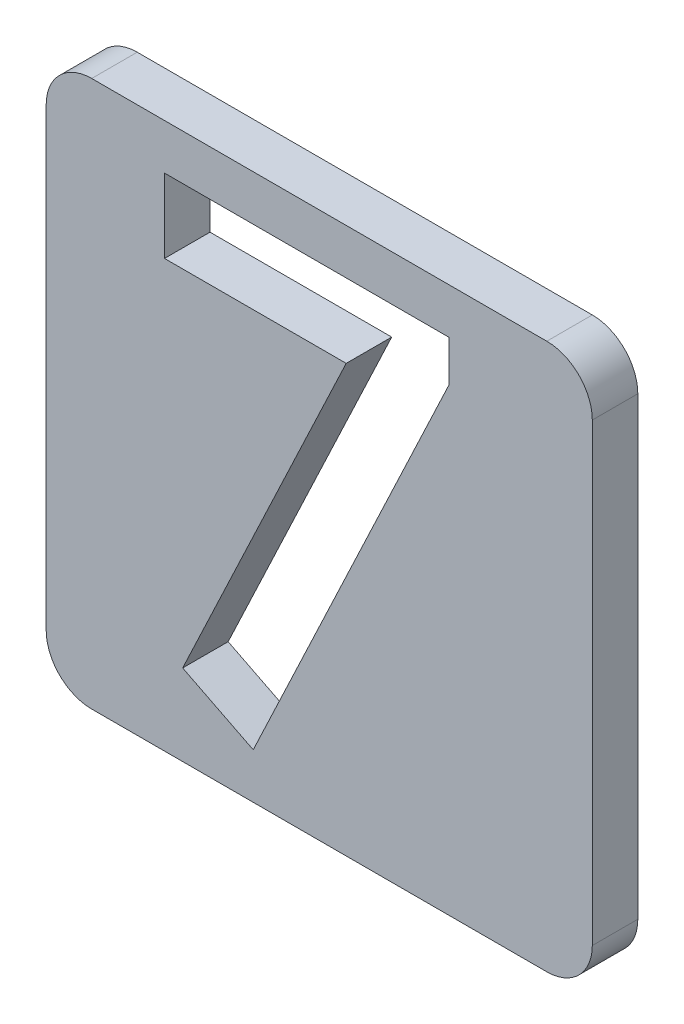
ISO-10303-21;
HEADER;
FILE_DESCRIPTION(('STEP AP214'),'2;1');
FILE_NAME('part.step','',(''),(''),'','','');
FILE_SCHEMA(('AUTOMOTIVE_DESIGN { 1 0 10303 214 1 1 1 1 }'));
ENDSEC;
DATA;
#1=APPLICATION_CONTEXT('core data for automotive mechanical design processes');
#2=APPLICATION_PROTOCOL_DEFINITION('international standard','automotive_design',2000,#1);
#3=PRODUCT_CONTEXT('',#1,'mechanical');
#4=PRODUCT('Part','Part','',(#3));
#5=PRODUCT_RELATED_PRODUCT_CATEGORY('part','',(#4));
#6=PRODUCT_DEFINITION_FORMATION('','',#4);
#7=PRODUCT_DEFINITION_CONTEXT('part definition',#1,'design');
#8=PRODUCT_DEFINITION('design','',#6,#7);
#9=PRODUCT_DEFINITION_SHAPE('','',#8);
#10=(LENGTH_UNIT() NAMED_UNIT(*) SI_UNIT(.MILLI.,.METRE.));
#11=(NAMED_UNIT(*) PLANE_ANGLE_UNIT() SI_UNIT($,.RADIAN.));
#12=(NAMED_UNIT(*) SI_UNIT($,.STERADIAN.) SOLID_ANGLE_UNIT());
#13=UNCERTAINTY_MEASURE_WITH_UNIT(LENGTH_MEASURE(1.E-05),#10,'distance_accuracy_value','');
#14=(GEOMETRIC_REPRESENTATION_CONTEXT(3) GLOBAL_UNCERTAINTY_ASSIGNED_CONTEXT((#13)) GLOBAL_UNIT_ASSIGNED_CONTEXT((#10,
#11,#12)) REPRESENTATION_CONTEXT('',''));
#15=CARTESIAN_POINT('',(0.,0.,0.));
#16=DIRECTION('',(0.,0.,1.));
#17=DIRECTION('',(1.,0.,0.));
#18=AXIS2_PLACEMENT_3D('',#15,#16,#17);
#19=CARTESIAN_POINT('',(50.,50.,10.));
#20=DIRECTION('',(0.,0.,-1.));
#21=DIRECTION('',(-1.,0.,0.));
#22=AXIS2_PLACEMENT_3D('',#19,#20,#21);
#23=PLANE('',#22);
#24=DIRECTION('',(1.,0.,0.));
#25=VECTOR('',#24,1.);
#26=CARTESIAN_POINT('',(-49.9999999999999,60.,10.));
#27=LINE('',#26,#25);
#28=CARTESIAN_POINT('',(-49.9999999999999,60.,10.));
#29=VERTEX_POINT('',#28);
#30=CARTESIAN_POINT('',(49.9999999999999,60.,10.));
#31=VERTEX_POINT('',#30);
#32=EDGE_CURVE('E200',#29,#31,#27,.T.);
#33=ORIENTED_EDGE('',*,*,#32,.F.);
#34=CARTESIAN_POINT('',(-50.,50.,10.));
#35=DIRECTION('',(0.,0.,1.));
#36=DIRECTION('',(1.,0.,0.));
#37=AXIS2_PLACEMENT_3D('',#34,#35,#36);
#38=CIRCLE('',#37,10.);
#39=CARTESIAN_POINT('',(-60.,49.9999999999999,10.));
#40=VERTEX_POINT('',#39);
#41=EDGE_CURVE('E218',#29,#40,#38,.T.);
#42=ORIENTED_EDGE('',*,*,#41,.T.);
#43=DIRECTION('',(0.,-1.,0.));
#44=VECTOR('',#43,1.);
#45=CARTESIAN_POINT('',(-60.,49.9999999999999,10.));
#46=LINE('',#45,#44);
#47=CARTESIAN_POINT('',(-60.,-49.9999999999999,10.));
#48=VERTEX_POINT('',#47);
#49=EDGE_CURVE('E216',#40,#48,#46,.T.);
#50=ORIENTED_EDGE('',*,*,#49,.T.);
#51=CARTESIAN_POINT('',(-50.,-50.,10.));
#52=DIRECTION('',(0.,0.,1.));
#53=DIRECTION('',(1.,0.,0.));
#54=AXIS2_PLACEMENT_3D('',#51,#52,#53);
#55=CIRCLE('',#54,10.);
#56=CARTESIAN_POINT('',(-49.9999999999999,-60.,10.));
#57=VERTEX_POINT('',#56);
#58=EDGE_CURVE('E214',#48,#57,#55,.T.);
#59=ORIENTED_EDGE('',*,*,#58,.T.);
#60=DIRECTION('',(1.,0.,0.));
#61=VECTOR('',#60,1.);
#62=CARTESIAN_POINT('',(-49.9999999999999,-60.,10.));
#63=LINE('',#62,#61);
#64=CARTESIAN_POINT('',(49.9999999999999,-60.,10.));
#65=VERTEX_POINT('',#64);
#66=EDGE_CURVE('E212',#57,#65,#63,.T.);
#67=ORIENTED_EDGE('',*,*,#66,.T.);
#68=CARTESIAN_POINT('',(50.,-50.,10.));
#69=DIRECTION('',(0.,0.,1.));
#70=DIRECTION('',(1.,0.,0.));
#71=AXIS2_PLACEMENT_3D('',#68,#69,#70);
#72=CIRCLE('',#71,10.);
#73=CARTESIAN_POINT('',(60.,-50.,10.));
#74=VERTEX_POINT('',#73);
#75=EDGE_CURVE('E210',#65,#74,#72,.T.);
#76=ORIENTED_EDGE('',*,*,#75,.T.);
#77=DIRECTION('',(0.,-1.,0.));
#78=VECTOR('',#77,1.);
#79=CARTESIAN_POINT('',(60.,49.9999999999999,10.));
#80=LINE('',#79,#78);
#81=CARTESIAN_POINT('',(60.,49.9999999999999,10.));
#82=VERTEX_POINT('',#81);
#83=EDGE_CURVE('E207',#82,#74,#80,.T.);
#84=ORIENTED_EDGE('',*,*,#83,.F.);
#85=CARTESIAN_POINT('',(50.,50.,10.));
#86=DIRECTION('',(0.,0.,-1.));
#87=DIRECTION('',(-1.,0.,0.));
#88=AXIS2_PLACEMENT_3D('',#85,#86,#87);
#89=CIRCLE('',#88,10.);
#90=EDGE_CURVE('E203',#31,#82,#89,.T.);
#91=ORIENTED_EDGE('',*,*,#90,.F.);
#92=EDGE_LOOP('',(#33,#42,#50,#59,#67,#76,#84,#91));
#93=FACE_BOUND('',#92,.T.);
#94=DIRECTION('',(0.,1.,0.));
#95=VECTOR('',#94,1.);
#96=CARTESIAN_POINT('',(-34.,33.75,10.));
#97=LINE('',#96,#95);
#98=CARTESIAN_POINT('',(-34.,33.75,10.));
#99=VERTEX_POINT('',#98);
#100=CARTESIAN_POINT('',(-34.,50.,10.));
#101=VERTEX_POINT('',#100);
#102=EDGE_CURVE('E50',#99,#101,#97,.T.);
#103=ORIENTED_EDGE('',*,*,#102,.T.);
#104=DIRECTION('',(1.,0.,0.));
#105=VECTOR('',#104,1.);
#106=CARTESIAN_POINT('',(-34.,50.,10.));
#107=LINE('',#106,#105);
#108=CARTESIAN_POINT('',(28.5,50.,10.));
#109=VERTEX_POINT('',#108);
#110=EDGE_CURVE('E156',#101,#109,#107,.T.);
#111=ORIENTED_EDGE('',*,*,#110,.T.);
#112=DIRECTION('',(0.,-1.,0.));
#113=VECTOR('',#112,1.);
#114=CARTESIAN_POINT('',(28.5,50.,10.));
#115=LINE('',#114,#113);
#116=CARTESIAN_POINT('',(28.5,40.91796875,10.));
#117=VERTEX_POINT('',#116);
#118=EDGE_CURVE('E177',#109,#117,#115,.T.);
#119=ORIENTED_EDGE('',*,*,#118,.T.);
#120=DIRECTION('',(-0.427610471419761,-0.903963099209348,0.));
#121=VECTOR('',#120,1.);
#122=CARTESIAN_POINT('',(28.5,40.91796875,10.));
#123=LINE('',#122,#121);
#124=CARTESIAN_POINT('',(-14.5078125,-50.,10.));
#125=VERTEX_POINT('',#124);
#126=EDGE_CURVE('E180',#117,#125,#123,.T.);
#127=ORIENTED_EDGE('',*,*,#126,.T.);
#128=DIRECTION('',(-0.893073384293623,0.44991102483306,0.));
#129=VECTOR('',#128,1.);
#130=CARTESIAN_POINT('',(-14.5078125,-50.,10.));
#131=LINE('',#130,#129);
#132=CARTESIAN_POINT('',(-30.015625,-42.1875,10.));
#133=VERTEX_POINT('',#132);
#134=EDGE_CURVE('E183',#125,#133,#131,.T.);
#135=ORIENTED_EDGE('',*,*,#134,.T.);
#136=DIRECTION('',(0.427766523959501,0.903889263670946,0.));
#137=VECTOR('',#136,1.);
#138=CARTESIAN_POINT('',(-30.015625,-42.1875,10.));
#139=LINE('',#138,#137);
#140=CARTESIAN_POINT('',(5.921875,33.75,10.));
#141=VERTEX_POINT('',#140);
#142=EDGE_CURVE('E186',#133,#141,#139,.T.);
#143=ORIENTED_EDGE('',*,*,#142,.T.);
#144=DIRECTION('',(-1.,0.,0.));
#145=VECTOR('',#144,1.);
#146=CARTESIAN_POINT('',(5.921875,33.75,10.));
#147=LINE('',#146,#145);
#148=EDGE_CURVE('E150',#141,#99,#147,.T.);
#149=ORIENTED_EDGE('',*,*,#148,.T.);
#150=EDGE_LOOP('',(#103,#111,#119,#127,#135,#143,#149));
#151=FACE_BOUND('',#150,.T.);
#152=ADVANCED_FACE('F33',(#93,#151),#23,.F.);
#153=CARTESIAN_POINT('',(50.,50.,0.));
#154=DIRECTION('',(0.,0.,-1.));
#155=DIRECTION('',(-1.,0.,0.));
#156=AXIS2_PLACEMENT_3D('',#153,#154,#155);
#157=PLANE('',#156);
#158=DIRECTION('',(1.,0.,0.));
#159=VECTOR('',#158,1.);
#160=CARTESIAN_POINT('',(-49.9999999999999,60.,0.));
#161=LINE('',#160,#159);
#162=CARTESIAN_POINT('',(-49.9999999999999,60.,0.));
#163=VERTEX_POINT('',#162);
#164=CARTESIAN_POINT('',(49.9999999999999,60.,0.));
#165=VERTEX_POINT('',#164);
#166=EDGE_CURVE('E157',#163,#165,#161,.T.);
#167=ORIENTED_EDGE('',*,*,#166,.T.);
#168=CARTESIAN_POINT('',(50.,50.,0.));
#169=DIRECTION('',(0.,0.,-1.));
#170=DIRECTION('',(-1.,0.,0.));
#171=AXIS2_PLACEMENT_3D('',#168,#169,#170);
#172=CIRCLE('',#171,10.);
#173=CARTESIAN_POINT('',(60.,49.9999999999999,0.));
#174=VERTEX_POINT('',#173);
#175=EDGE_CURVE('E222',#165,#174,#172,.T.);
#176=ORIENTED_EDGE('',*,*,#175,.T.);
#177=DIRECTION('',(0.,-1.,0.));
#178=VECTOR('',#177,1.);
#179=CARTESIAN_POINT('',(60.,49.9999999999999,0.));
#180=LINE('',#179,#178);
#181=CARTESIAN_POINT('',(60.,-50.,0.));
#182=VERTEX_POINT('',#181);
#183=EDGE_CURVE('E225',#174,#182,#180,.T.);
#184=ORIENTED_EDGE('',*,*,#183,.T.);
#185=CARTESIAN_POINT('',(50.,-50.,0.));
#186=DIRECTION('',(0.,0.,1.));
#187=DIRECTION('',(1.,0.,0.));
#188=AXIS2_PLACEMENT_3D('',#185,#186,#187);
#189=CIRCLE('',#188,10.);
#190=CARTESIAN_POINT('',(49.9999999999999,-60.,0.));
#191=VERTEX_POINT('',#190);
#192=EDGE_CURVE('E228',#191,#182,#189,.T.);
#193=ORIENTED_EDGE('',*,*,#192,.F.);
#194=DIRECTION('',(1.,0.,0.));
#195=VECTOR('',#194,1.);
#196=CARTESIAN_POINT('',(-49.9999999999999,-60.,0.));
#197=LINE('',#196,#195);
#198=CARTESIAN_POINT('',(-49.9999999999999,-60.,0.));
#199=VERTEX_POINT('',#198);
#200=EDGE_CURVE('E231',#199,#191,#197,.T.);
#201=ORIENTED_EDGE('',*,*,#200,.F.);
#202=CARTESIAN_POINT('',(-50.,-50.,0.));
#203=DIRECTION('',(0.,0.,1.));
#204=DIRECTION('',(1.,0.,0.));
#205=AXIS2_PLACEMENT_3D('',#202,#203,#204);
#206=CIRCLE('',#205,10.);
#207=CARTESIAN_POINT('',(-60.,-49.9999999999999,0.));
#208=VERTEX_POINT('',#207);
#209=EDGE_CURVE('E233',#208,#199,#206,.T.);
#210=ORIENTED_EDGE('',*,*,#209,.F.);
#211=DIRECTION('',(0.,-1.,0.));
#212=VECTOR('',#211,1.);
#213=CARTESIAN_POINT('',(-60.,49.9999999999999,0.));
#214=LINE('',#213,#212);
#215=CARTESIAN_POINT('',(-60.,49.9999999999999,0.));
#216=VERTEX_POINT('',#215);
#217=EDGE_CURVE('E235',#216,#208,#214,.T.);
#218=ORIENTED_EDGE('',*,*,#217,.F.);
#219=CARTESIAN_POINT('',(-50.,50.,0.));
#220=DIRECTION('',(0.,0.,1.));
#221=DIRECTION('',(1.,0.,0.));
#222=AXIS2_PLACEMENT_3D('',#219,#220,#221);
#223=CIRCLE('',#222,10.);
#224=EDGE_CURVE('E204',#163,#216,#223,.T.);
#225=ORIENTED_EDGE('',*,*,#224,.F.);
#226=EDGE_LOOP('',(#167,#176,#184,#193,#201,#210,#218,#225));
#227=FACE_BOUND('',#226,.T.);
#228=DIRECTION('',(1.,0.,0.));
#229=VECTOR('',#228,1.);
#230=CARTESIAN_POINT('',(-34.,50.,0.));
#231=LINE('',#230,#229);
#232=CARTESIAN_POINT('',(-34.,50.,0.));
#233=VERTEX_POINT('',#232);
#234=CARTESIAN_POINT('',(28.5,50.,0.));
#235=VERTEX_POINT('',#234);
#236=EDGE_CURVE('E149',#233,#235,#231,.T.);
#237=ORIENTED_EDGE('',*,*,#236,.F.);
#238=DIRECTION('',(0.,1.,0.));
#239=VECTOR('',#238,1.);
#240=CARTESIAN_POINT('',(-34.,33.75,0.));
#241=LINE('',#240,#239);
#242=CARTESIAN_POINT('',(-34.,33.75,0.));
#243=VERTEX_POINT('',#242);
#244=EDGE_CURVE('E141',#243,#233,#241,.T.);
#245=ORIENTED_EDGE('',*,*,#244,.F.);
#246=DIRECTION('',(-1.,0.,0.));
#247=VECTOR('',#246,1.);
#248=CARTESIAN_POINT('',(5.921875,33.75,0.));
#249=LINE('',#248,#247);
#250=CARTESIAN_POINT('',(5.921875,33.75,0.));
#251=VERTEX_POINT('',#250);
#252=EDGE_CURVE('E173',#251,#243,#249,.T.);
#253=ORIENTED_EDGE('',*,*,#252,.F.);
#254=DIRECTION('',(0.427766523959501,0.903889263670946,0.));
#255=VECTOR('',#254,1.);
#256=CARTESIAN_POINT('',(-30.015625,-42.1875,0.));
#257=LINE('',#256,#255);
#258=CARTESIAN_POINT('',(-30.015625,-42.1875,0.));
#259=VERTEX_POINT('',#258);
#260=EDGE_CURVE('E171',#259,#251,#257,.T.);
#261=ORIENTED_EDGE('',*,*,#260,.F.);
#262=DIRECTION('',(-0.893073384293623,0.44991102483306,0.));
#263=VECTOR('',#262,1.);
#264=CARTESIAN_POINT('',(-14.5078125,-50.,0.));
#265=LINE('',#264,#263);
#266=CARTESIAN_POINT('',(-14.5078125,-50.,0.));
#267=VERTEX_POINT('',#266);
#268=EDGE_CURVE('E169',#267,#259,#265,.T.);
#269=ORIENTED_EDGE('',*,*,#268,.F.);
#270=DIRECTION('',(-0.427610471419761,-0.903963099209348,0.));
#271=VECTOR('',#270,1.);
#272=CARTESIAN_POINT('',(28.5,40.91796875,0.));
#273=LINE('',#272,#271);
#274=CARTESIAN_POINT('',(28.5,40.91796875,0.));
#275=VERTEX_POINT('',#274);
#276=EDGE_CURVE('E165',#275,#267,#273,.T.);
#277=ORIENTED_EDGE('',*,*,#276,.F.);
#278=DIRECTION('',(0.,-1.,0.));
#279=VECTOR('',#278,1.);
#280=CARTESIAN_POINT('',(28.5,50.,0.));
#281=LINE('',#280,#279);
#282=EDGE_CURVE('E163',#235,#275,#281,.T.);
#283=ORIENTED_EDGE('',*,*,#282,.F.);
#284=EDGE_LOOP('',(#237,#245,#253,#261,#269,#277,#283));
#285=FACE_BOUND('',#284,.T.);
#286=ADVANCED_FACE('F161',(#227,#285),#157,.T.);
#287=CARTESIAN_POINT('',(-49.9999999999999,60.,10.));
#288=DIRECTION('',(0.,1.,0.));
#289=DIRECTION('',(0.,0.,1.));
#290=AXIS2_PLACEMENT_3D('',#287,#288,#289);
#291=PLANE('',#290);
#292=ORIENTED_EDGE('',*,*,#166,.F.);
#293=DIRECTION('',(0.,0.,-1.));
#294=VECTOR('',#293,1.);
#295=CARTESIAN_POINT('',(-49.9999999999999,60.,10.));
#296=LINE('',#295,#294);
#297=EDGE_CURVE('E11',#29,#163,#296,.T.);
#298=ORIENTED_EDGE('',*,*,#297,.F.);
#299=ORIENTED_EDGE('',*,*,#32,.T.);
#300=DIRECTION('',(0.,0.,-1.));
#301=VECTOR('',#300,1.);
#302=CARTESIAN_POINT('',(49.9999999999999,60.,10.));
#303=LINE('',#302,#301);
#304=EDGE_CURVE('E37',#31,#165,#303,.T.);
#305=ORIENTED_EDGE('',*,*,#304,.T.);
#306=EDGE_LOOP('',(#292,#298,#299,#305));
#307=FACE_BOUND('',#306,.T.);
#308=ADVANCED_FACE('F35',(#307),#291,.T.);
#309=CARTESIAN_POINT('',(-50.,50.,10.));
#310=DIRECTION('',(0.,0.,-1.));
#311=DIRECTION('',(-1.,0.,0.));
#312=AXIS2_PLACEMENT_3D('',#309,#310,#311);
#313=CYLINDRICAL_SURFACE('',#312,10.);
#314=ORIENTED_EDGE('',*,*,#224,.T.);
#315=DIRECTION('',(0.,0.,-1.));
#316=VECTOR('',#315,1.);
#317=CARTESIAN_POINT('',(-60.,49.9999999999999,10.));
#318=LINE('',#317,#316);
#319=EDGE_CURVE('E42',#40,#216,#318,.T.);
#320=ORIENTED_EDGE('',*,*,#319,.F.);
#321=ORIENTED_EDGE('',*,*,#41,.F.);
#322=ORIENTED_EDGE('',*,*,#297,.T.);
#323=EDGE_LOOP('',(#314,#320,#321,#322));
#324=FACE_BOUND('',#323,.T.);
#325=ADVANCED_FACE('F265',(#324),#313,.T.);
#326=CARTESIAN_POINT('',(-60.,49.9999999999999,10.));
#327=DIRECTION('',(1.,0.,0.));
#328=DIRECTION('',(0.,1.,0.));
#329=AXIS2_PLACEMENT_3D('',#326,#327,#328);
#330=PLANE('',#329);
#331=ORIENTED_EDGE('',*,*,#217,.T.);
#332=DIRECTION('',(0.,0.,-1.));
#333=VECTOR('',#332,1.);
#334=CARTESIAN_POINT('',(-60.,-49.9999999999999,10.));
#335=LINE('',#334,#333);
#336=EDGE_CURVE('E240',#48,#208,#335,.T.);
#337=ORIENTED_EDGE('',*,*,#336,.F.);
#338=ORIENTED_EDGE('',*,*,#49,.F.);
#339=ORIENTED_EDGE('',*,*,#319,.T.);
#340=EDGE_LOOP('',(#331,#337,#338,#339));
#341=FACE_BOUND('',#340,.T.);
#342=ADVANCED_FACE('F269',(#341),#330,.F.);
#343=CARTESIAN_POINT('',(-50.,-50.,10.));
#344=DIRECTION('',(0.,0.,-1.));
#345=DIRECTION('',(-1.,0.,0.));
#346=AXIS2_PLACEMENT_3D('',#343,#344,#345);
#347=CYLINDRICAL_SURFACE('',#346,10.);
#348=ORIENTED_EDGE('',*,*,#209,.T.);
#349=DIRECTION('',(0.,0.,-1.));
#350=VECTOR('',#349,1.);
#351=CARTESIAN_POINT('',(-49.9999999999999,-60.,10.));
#352=LINE('',#351,#350);
#353=EDGE_CURVE('E243',#57,#199,#352,.T.);
#354=ORIENTED_EDGE('',*,*,#353,.F.);
#355=ORIENTED_EDGE('',*,*,#58,.F.);
#356=ORIENTED_EDGE('',*,*,#336,.T.);
#357=EDGE_LOOP('',(#348,#354,#355,#356));
#358=FACE_BOUND('',#357,.T.);
#359=ADVANCED_FACE('F289',(#358),#347,.T.);
#360=CARTESIAN_POINT('',(-49.9999999999999,-60.,10.));
#361=DIRECTION('',(0.,1.,0.));
#362=DIRECTION('',(0.,0.,1.));
#363=AXIS2_PLACEMENT_3D('',#360,#361,#362);
#364=PLANE('',#363);
#365=ORIENTED_EDGE('',*,*,#200,.T.);
#366=DIRECTION('',(0.,0.,-1.));
#367=VECTOR('',#366,1.);
#368=CARTESIAN_POINT('',(49.9999999999999,-60.,10.));
#369=LINE('',#368,#367);
#370=EDGE_CURVE('E246',#65,#191,#369,.T.);
#371=ORIENTED_EDGE('',*,*,#370,.F.);
#372=ORIENTED_EDGE('',*,*,#66,.F.);
#373=ORIENTED_EDGE('',*,*,#353,.T.);
#374=EDGE_LOOP('',(#365,#371,#372,#373));
#375=FACE_BOUND('',#374,.T.);
#376=ADVANCED_FACE('F287',(#375),#364,.F.);
#377=CARTESIAN_POINT('',(50.,-50.,10.));
#378=DIRECTION('',(0.,0.,-1.));
#379=DIRECTION('',(-1.,0.,0.));
#380=AXIS2_PLACEMENT_3D('',#377,#378,#379);
#381=CYLINDRICAL_SURFACE('',#380,10.);
#382=ORIENTED_EDGE('',*,*,#192,.T.);
#383=DIRECTION('',(0.,0.,-1.));
#384=VECTOR('',#383,1.);
#385=CARTESIAN_POINT('',(60.,-50.,10.));
#386=LINE('',#385,#384);
#387=EDGE_CURVE('E249',#74,#182,#386,.T.);
#388=ORIENTED_EDGE('',*,*,#387,.F.);
#389=ORIENTED_EDGE('',*,*,#75,.F.);
#390=ORIENTED_EDGE('',*,*,#370,.T.);
#391=EDGE_LOOP('',(#382,#388,#389,#390));
#392=FACE_BOUND('',#391,.T.);
#393=ADVANCED_FACE('F283',(#392),#381,.T.);
#394=CARTESIAN_POINT('',(60.,49.9999999999999,10.));
#395=DIRECTION('',(1.,0.,0.));
#396=DIRECTION('',(0.,1.,0.));
#397=AXIS2_PLACEMENT_3D('',#394,#395,#396);
#398=PLANE('',#397);
#399=ORIENTED_EDGE('',*,*,#183,.F.);
#400=DIRECTION('',(0.,0.,-1.));
#401=VECTOR('',#400,1.);
#402=CARTESIAN_POINT('',(60.,49.9999999999999,10.));
#403=LINE('',#402,#401);
#404=EDGE_CURVE('E250',#82,#174,#403,.T.);
#405=ORIENTED_EDGE('',*,*,#404,.F.);
#406=ORIENTED_EDGE('',*,*,#83,.T.);
#407=ORIENTED_EDGE('',*,*,#387,.T.);
#408=EDGE_LOOP('',(#399,#405,#406,#407));
#409=FACE_BOUND('',#408,.T.);
#410=ADVANCED_FACE('F279',(#409),#398,.T.);
#411=CARTESIAN_POINT('',(50.,50.,10.));
#412=DIRECTION('',(0.,0.,-1.));
#413=DIRECTION('',(-1.,0.,0.));
#414=AXIS2_PLACEMENT_3D('',#411,#412,#413);
#415=CYLINDRICAL_SURFACE('',#414,10.);
#416=ORIENTED_EDGE('',*,*,#175,.F.);
#417=ORIENTED_EDGE('',*,*,#304,.F.);
#418=ORIENTED_EDGE('',*,*,#90,.T.);
#419=ORIENTED_EDGE('',*,*,#404,.T.);
#420=EDGE_LOOP('',(#416,#417,#418,#419));
#421=FACE_BOUND('',#420,.T.);
#422=ADVANCED_FACE('F258',(#421),#415,.T.);
#423=CARTESIAN_POINT('',(-34.,33.75,0.));
#424=DIRECTION('',(1.,0.,0.));
#425=DIRECTION('',(0.,0.,-1.));
#426=AXIS2_PLACEMENT_3D('',#423,#424,#425);
#427=PLANE('',#426);
#428=ORIENTED_EDGE('',*,*,#102,.F.);
#429=DIRECTION('',(0.,0.,1.));
#430=VECTOR('',#429,1.);
#431=CARTESIAN_POINT('',(-34.,33.75,0.));
#432=LINE('',#431,#430);
#433=EDGE_CURVE('E145',#243,#99,#432,.T.);
#434=ORIENTED_EDGE('',*,*,#433,.F.);
#435=ORIENTED_EDGE('',*,*,#244,.T.);
#436=DIRECTION('',(0.,0.,1.));
#437=VECTOR('',#436,1.);
#438=CARTESIAN_POINT('',(-34.,50.,0.));
#439=LINE('',#438,#437);
#440=EDGE_CURVE('E144',#233,#101,#439,.T.);
#441=ORIENTED_EDGE('',*,*,#440,.T.);
#442=EDGE_LOOP('',(#428,#434,#435,#441));
#443=FACE_BOUND('',#442,.T.);
#444=ADVANCED_FACE('F143',(#443),#427,.T.);
#445=CARTESIAN_POINT('',(-34.,50.,0.));
#446=DIRECTION('',(0.,-1.,0.));
#447=DIRECTION('',(0.,0.,-1.));
#448=AXIS2_PLACEMENT_3D('',#445,#446,#447);
#449=PLANE('',#448);
#450=ORIENTED_EDGE('',*,*,#110,.F.);
#451=ORIENTED_EDGE('',*,*,#440,.F.);
#452=ORIENTED_EDGE('',*,*,#236,.T.);
#453=DIRECTION('',(0.,0.,1.));
#454=VECTOR('',#453,1.);
#455=CARTESIAN_POINT('',(28.5,50.,0.));
#456=LINE('',#455,#454);
#457=EDGE_CURVE('E158',#235,#109,#456,.T.);
#458=ORIENTED_EDGE('',*,*,#457,.T.);
#459=EDGE_LOOP('',(#450,#451,#452,#458));
#460=FACE_BOUND('',#459,.T.);
#461=ADVANCED_FACE('F153',(#460),#449,.T.);
#462=CARTESIAN_POINT('',(28.5,50.,0.));
#463=DIRECTION('',(-1.,0.,0.));
#464=DIRECTION('',(0.,0.,1.));
#465=AXIS2_PLACEMENT_3D('',#462,#463,#464);
#466=PLANE('',#465);
#467=ORIENTED_EDGE('',*,*,#118,.F.);
#468=ORIENTED_EDGE('',*,*,#457,.F.);
#469=ORIENTED_EDGE('',*,*,#282,.T.);
#470=DIRECTION('',(0.,0.,1.));
#471=VECTOR('',#470,1.);
#472=CARTESIAN_POINT('',(28.5,40.91796875,0.));
#473=LINE('',#472,#471);
#474=EDGE_CURVE('E197',#275,#117,#473,.T.);
#475=ORIENTED_EDGE('',*,*,#474,.T.);
#476=EDGE_LOOP('',(#467,#468,#469,#475));
#477=FACE_BOUND('',#476,.T.);
#478=ADVANCED_FACE('F338',(#477),#466,.T.);
#479=CARTESIAN_POINT('',(28.5,40.91796875,0.));
#480=DIRECTION('',(-0.903963099209348,0.427610471419761,0.));
#481=DIRECTION('',(-0.427610471419761,-0.903963099209348,0.));
#482=AXIS2_PLACEMENT_3D('',#479,#480,#481);
#483=PLANE('',#482);
#484=ORIENTED_EDGE('',*,*,#126,.F.);
#485=ORIENTED_EDGE('',*,*,#474,.F.);
#486=ORIENTED_EDGE('',*,*,#276,.T.);
#487=DIRECTION('',(0.,0.,1.));
#488=VECTOR('',#487,1.);
#489=CARTESIAN_POINT('',(-14.5078125,-50.,0.));
#490=LINE('',#489,#488);
#491=EDGE_CURVE('E195',#267,#125,#490,.T.);
#492=ORIENTED_EDGE('',*,*,#491,.T.);
#493=EDGE_LOOP('',(#484,#485,#486,#492));
#494=FACE_BOUND('',#493,.T.);
#495=ADVANCED_FACE('F346',(#494),#483,.T.);
#496=CARTESIAN_POINT('',(-14.5078125,-50.,0.));
#497=DIRECTION('',(0.44991102483306,0.893073384293623,0.));
#498=DIRECTION('',(-0.893073384293623,0.44991102483306,0.));
#499=AXIS2_PLACEMENT_3D('',#496,#497,#498);
#500=PLANE('',#499);
#501=ORIENTED_EDGE('',*,*,#134,.F.);
#502=ORIENTED_EDGE('',*,*,#491,.F.);
#503=ORIENTED_EDGE('',*,*,#268,.T.);
#504=DIRECTION('',(0.,0.,1.));
#505=VECTOR('',#504,1.);
#506=CARTESIAN_POINT('',(-30.015625,-42.1875,0.));
#507=LINE('',#506,#505);
#508=EDGE_CURVE('E193',#259,#133,#507,.T.);
#509=ORIENTED_EDGE('',*,*,#508,.T.);
#510=EDGE_LOOP('',(#501,#502,#503,#509));
#511=FACE_BOUND('',#510,.T.);
#512=ADVANCED_FACE('F356',(#511),#500,.T.);
#513=CARTESIAN_POINT('',(-30.015625,-42.1875,0.));
#514=DIRECTION('',(0.903889263670946,-0.427766523959501,0.));
#515=DIRECTION('',(0.427766523959501,0.903889263670946,0.));
#516=AXIS2_PLACEMENT_3D('',#513,#514,#515);
#517=PLANE('',#516);
#518=ORIENTED_EDGE('',*,*,#142,.F.);
#519=ORIENTED_EDGE('',*,*,#508,.F.);
#520=ORIENTED_EDGE('',*,*,#260,.T.);
#521=DIRECTION('',(0.,0.,1.));
#522=VECTOR('',#521,1.);
#523=CARTESIAN_POINT('',(5.921875,33.75,0.));
#524=LINE('',#523,#522);
#525=EDGE_CURVE('E58',#251,#141,#524,.T.);
#526=ORIENTED_EDGE('',*,*,#525,.T.);
#527=EDGE_LOOP('',(#518,#519,#520,#526));
#528=FACE_BOUND('',#527,.T.);
#529=ADVANCED_FACE('F366',(#528),#517,.T.);
#530=CARTESIAN_POINT('',(5.921875,33.75,0.));
#531=DIRECTION('',(0.,1.,0.));
#532=DIRECTION('',(0.,0.,1.));
#533=AXIS2_PLACEMENT_3D('',#530,#531,#532);
#534=PLANE('',#533);
#535=ORIENTED_EDGE('',*,*,#148,.F.);
#536=ORIENTED_EDGE('',*,*,#525,.F.);
#537=ORIENTED_EDGE('',*,*,#252,.T.);
#538=ORIENTED_EDGE('',*,*,#433,.T.);
#539=EDGE_LOOP('',(#535,#536,#537,#538));
#540=FACE_BOUND('',#539,.T.);
#541=ADVANCED_FACE('F376',(#540),#534,.T.);
#542=CLOSED_SHELL('',(#152,#286,#308,#325,#342,#359,#376,#393,#410,#422,#444,#461,#478,#495,
#512,#529,#541));
#543=MANIFOLD_SOLID_BREP('B2',#542);
#544=ADVANCED_BREP_SHAPE_REPRESENTATION('',(#18,#543),#14);
#545=SHAPE_DEFINITION_REPRESENTATION(#9,#544);
ENDSEC;
END-ISO-10303-21;
